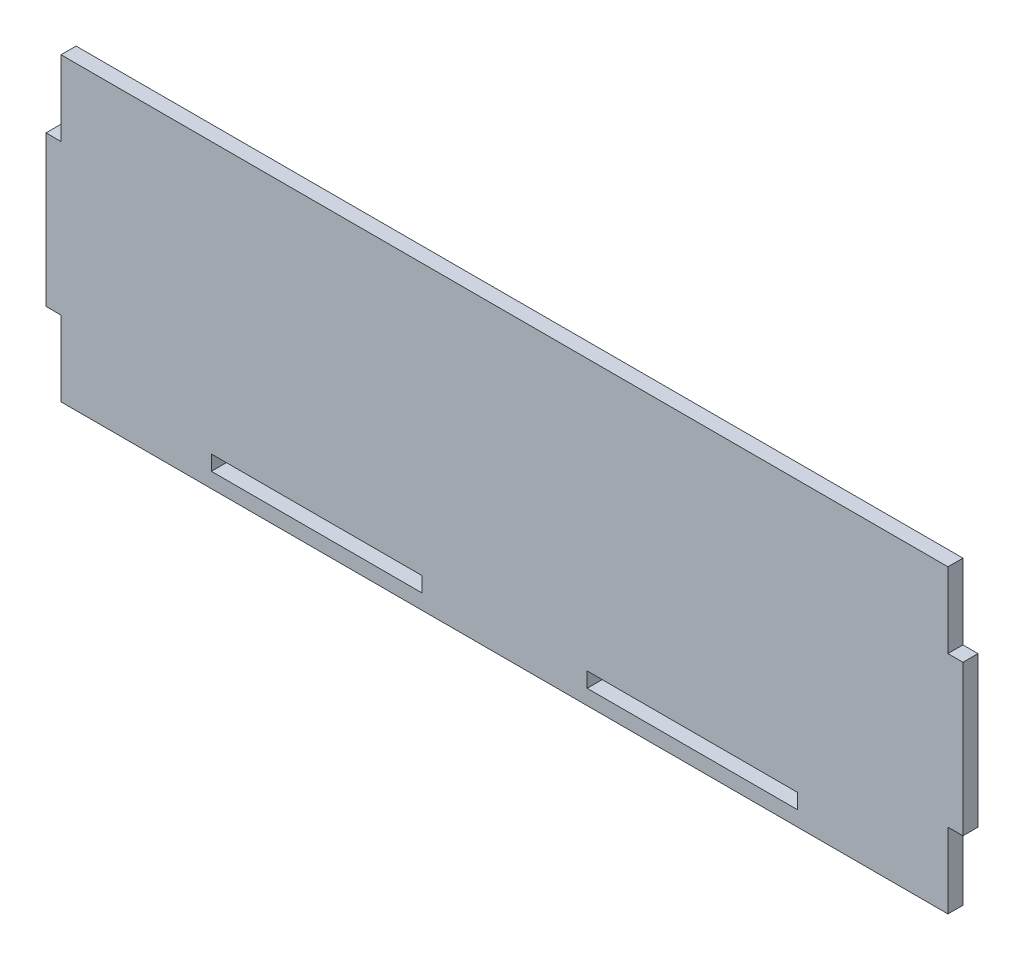
ISO-10303-21;
HEADER;
FILE_DESCRIPTION(('STEP AP214'),'2;1');
FILE_NAME('part.step','',(''),(''),'','','');
FILE_SCHEMA(('AUTOMOTIVE_DESIGN { 1 0 10303 214 1 1 1 1 }'));
ENDSEC;
DATA;
#1=APPLICATION_CONTEXT('core data for automotive mechanical design processes');
#2=APPLICATION_PROTOCOL_DEFINITION('international standard','automotive_design',2000,#1);
#3=PRODUCT_CONTEXT('',#1,'mechanical');
#4=PRODUCT('Part','Part','',(#3));
#5=PRODUCT_RELATED_PRODUCT_CATEGORY('part','',(#4));
#6=PRODUCT_DEFINITION_FORMATION('','',#4);
#7=PRODUCT_DEFINITION_CONTEXT('part definition',#1,'design');
#8=PRODUCT_DEFINITION('design','',#6,#7);
#9=PRODUCT_DEFINITION_SHAPE('','',#8);
#10=(LENGTH_UNIT() NAMED_UNIT(*) SI_UNIT(.MILLI.,.METRE.));
#11=(NAMED_UNIT(*) PLANE_ANGLE_UNIT() SI_UNIT($,.RADIAN.));
#12=(NAMED_UNIT(*) SI_UNIT($,.STERADIAN.) SOLID_ANGLE_UNIT());
#13=UNCERTAINTY_MEASURE_WITH_UNIT(LENGTH_MEASURE(1.E-05),#10,'distance_accuracy_value','');
#14=(GEOMETRIC_REPRESENTATION_CONTEXT(3) GLOBAL_UNCERTAINTY_ASSIGNED_CONTEXT((#13)) GLOBAL_UNIT_ASSIGNED_CONTEXT((#10,
#11,#12)) REPRESENTATION_CONTEXT('',''));
#15=CARTESIAN_POINT('',(0.,0.,0.));
#16=DIRECTION('',(0.,0.,1.));
#17=DIRECTION('',(1.,0.,0.));
#18=AXIS2_PLACEMENT_3D('',#15,#16,#17);
#19=CARTESIAN_POINT('',(-295.,0.,5.));
#20=DIRECTION('',(-1.,0.,0.));
#21=DIRECTION('',(0.,0.,1.));
#22=AXIS2_PLACEMENT_3D('',#19,#20,#21);
#23=PLANE('',#22);
#24=DIRECTION('',(0.,1.,0.));
#25=VECTOR('',#24,1.);
#26=CARTESIAN_POINT('',(-295.,0.,0.));
#27=LINE('',#26,#25);
#28=CARTESIAN_POINT('',(-295.,0.,0.));
#29=VERTEX_POINT('',#28);
#30=CARTESIAN_POINT('',(-295.,25.,0.));
#31=VERTEX_POINT('',#30);
#32=EDGE_CURVE('E209',#29,#31,#27,.T.);
#33=ORIENTED_EDGE('',*,*,#32,.F.);
#34=DIRECTION('',(0.,0.,-1.));
#35=VECTOR('',#34,1.);
#36=CARTESIAN_POINT('',(-295.,0.,5.));
#37=LINE('',#36,#35);
#38=CARTESIAN_POINT('',(-295.,0.,5.));
#39=VERTEX_POINT('',#38);
#40=EDGE_CURVE('E11',#39,#29,#37,.T.);
#41=ORIENTED_EDGE('',*,*,#40,.F.);
#42=DIRECTION('',(0.,1.,0.));
#43=VECTOR('',#42,1.);
#44=CARTESIAN_POINT('',(-295.,0.,5.));
#45=LINE('',#44,#43);
#46=CARTESIAN_POINT('',(-295.,25.,5.));
#47=VERTEX_POINT('',#46);
#48=EDGE_CURVE('E242',#39,#47,#45,.T.);
#49=ORIENTED_EDGE('',*,*,#48,.T.);
#50=DIRECTION('',(0.,0.,-1.));
#51=VECTOR('',#50,1.);
#52=CARTESIAN_POINT('',(-295.,25.,5.));
#53=LINE('',#52,#51);
#54=EDGE_CURVE('E270',#47,#31,#53,.T.);
#55=ORIENTED_EDGE('',*,*,#54,.T.);
#56=EDGE_LOOP('',(#33,#41,#49,#55));
#57=FACE_BOUND('',#56,.T.);
#58=ADVANCED_FACE('F36',(#57),#23,.T.);
#59=CARTESIAN_POINT('',(0.,0.,5.));
#60=DIRECTION('',(0.,-1.,0.));
#61=DIRECTION('',(0.,0.,-1.));
#62=AXIS2_PLACEMENT_3D('',#59,#60,#61);
#63=PLANE('',#62);
#64=DIRECTION('',(-1.,0.,0.));
#65=VECTOR('',#64,1.);
#66=CARTESIAN_POINT('',(0.,0.,0.));
#67=LINE('',#66,#65);
#68=CARTESIAN_POINT('',(0.,0.,0.));
#69=VERTEX_POINT('',#68);
#70=EDGE_CURVE('E273',#69,#29,#67,.T.);
#71=ORIENTED_EDGE('',*,*,#70,.F.);
#72=DIRECTION('',(0.,0.,-1.));
#73=VECTOR('',#72,1.);
#74=CARTESIAN_POINT('',(0.,0.,5.));
#75=LINE('',#74,#73);
#76=CARTESIAN_POINT('',(0.,0.,5.));
#77=VERTEX_POINT('',#76);
#78=EDGE_CURVE('E44',#77,#69,#75,.T.);
#79=ORIENTED_EDGE('',*,*,#78,.F.);
#80=DIRECTION('',(-1.,0.,0.));
#81=VECTOR('',#80,1.);
#82=CARTESIAN_POINT('',(0.,0.,5.));
#83=LINE('',#82,#81);
#84=EDGE_CURVE('E245',#77,#39,#83,.T.);
#85=ORIENTED_EDGE('',*,*,#84,.T.);
#86=ORIENTED_EDGE('',*,*,#40,.T.);
#87=EDGE_LOOP('',(#71,#79,#85,#86));
#88=FACE_BOUND('',#87,.T.);
#89=ADVANCED_FACE('F38',(#88),#63,.T.);
#90=CARTESIAN_POINT('',(0.,0.,5.));
#91=DIRECTION('',(-1.,0.,0.));
#92=DIRECTION('',(0.,0.,1.));
#93=AXIS2_PLACEMENT_3D('',#90,#91,#92);
#94=PLANE('',#93);
#95=DIRECTION('',(0.,1.,0.));
#96=VECTOR('',#95,1.);
#97=CARTESIAN_POINT('',(0.,0.,0.));
#98=LINE('',#97,#96);
#99=CARTESIAN_POINT('',(0.,25.,0.));
#100=VERTEX_POINT('',#99);
#101=EDGE_CURVE('E277',#69,#100,#98,.T.);
#102=ORIENTED_EDGE('',*,*,#101,.T.);
#103=DIRECTION('',(0.,0.,-1.));
#104=VECTOR('',#103,1.);
#105=CARTESIAN_POINT('',(0.,25.,5.));
#106=LINE('',#105,#104);
#107=CARTESIAN_POINT('',(0.,25.,5.));
#108=VERTEX_POINT('',#107);
#109=EDGE_CURVE('E318',#108,#100,#106,.T.);
#110=ORIENTED_EDGE('',*,*,#109,.F.);
#111=DIRECTION('',(0.,1.,0.));
#112=VECTOR('',#111,1.);
#113=CARTESIAN_POINT('',(0.,0.,5.));
#114=LINE('',#113,#112);
#115=EDGE_CURVE('E250',#77,#108,#114,.T.);
#116=ORIENTED_EDGE('',*,*,#115,.F.);
#117=ORIENTED_EDGE('',*,*,#78,.T.);
#118=EDGE_LOOP('',(#102,#110,#116,#117));
#119=FACE_BOUND('',#118,.T.);
#120=ADVANCED_FACE('F323',(#119),#94,.F.);
#121=CARTESIAN_POINT('',(0.,25.,5.));
#122=DIRECTION('',(0.,1.,0.));
#123=DIRECTION('',(-1.,0.,0.));
#124=AXIS2_PLACEMENT_3D('',#121,#122,#123);
#125=PLANE('',#124);
#126=DIRECTION('',(1.,0.,0.));
#127=VECTOR('',#126,1.);
#128=CARTESIAN_POINT('',(0.,25.,0.));
#129=LINE('',#128,#127);
#130=CARTESIAN_POINT('',(5.,25.,0.));
#131=VERTEX_POINT('',#130);
#132=EDGE_CURVE('E279',#100,#131,#129,.T.);
#133=ORIENTED_EDGE('',*,*,#132,.T.);
#134=DIRECTION('',(0.,0.,-1.));
#135=VECTOR('',#134,1.);
#136=CARTESIAN_POINT('',(5.,25.,5.));
#137=LINE('',#136,#135);
#138=CARTESIAN_POINT('',(5.,25.,5.));
#139=VERTEX_POINT('',#138);
#140=EDGE_CURVE('E316',#139,#131,#137,.T.);
#141=ORIENTED_EDGE('',*,*,#140,.F.);
#142=DIRECTION('',(1.,0.,0.));
#143=VECTOR('',#142,1.);
#144=CARTESIAN_POINT('',(0.,25.,5.));
#145=LINE('',#144,#143);
#146=EDGE_CURVE('E252',#108,#139,#145,.T.);
#147=ORIENTED_EDGE('',*,*,#146,.F.);
#148=ORIENTED_EDGE('',*,*,#109,.T.);
#149=EDGE_LOOP('',(#133,#141,#147,#148));
#150=FACE_BOUND('',#149,.T.);
#151=ADVANCED_FACE('F372',(#150),#125,.F.);
#152=CARTESIAN_POINT('',(5.00000000000001,0.,5.));
#153=DIRECTION('',(1.,0.,0.));
#154=DIRECTION('',(0.,1.,0.));
#155=AXIS2_PLACEMENT_3D('',#152,#153,#154);
#156=PLANE('',#155);
#157=DIRECTION('',(0.,-1.,0.));
#158=VECTOR('',#157,1.);
#159=CARTESIAN_POINT('',(5.00000000000001,0.,0.));
#160=LINE('',#159,#158);
#161=CARTESIAN_POINT('',(5.,75.,0.));
#162=VERTEX_POINT('',#161);
#163=EDGE_CURVE('E283',#162,#131,#160,.T.);
#164=ORIENTED_EDGE('',*,*,#163,.F.);
#165=DIRECTION('',(0.,0.,-1.));
#166=VECTOR('',#165,1.);
#167=CARTESIAN_POINT('',(5.,75.,5.));
#168=LINE('',#167,#166);
#169=CARTESIAN_POINT('',(5.,75.,5.));
#170=VERTEX_POINT('',#169);
#171=EDGE_CURVE('E314',#170,#162,#168,.T.);
#172=ORIENTED_EDGE('',*,*,#171,.F.);
#173=DIRECTION('',(0.,-1.,0.));
#174=VECTOR('',#173,1.);
#175=CARTESIAN_POINT('',(5.00000000000001,0.,5.));
#176=LINE('',#175,#174);
#177=EDGE_CURVE('E255',#170,#139,#176,.T.);
#178=ORIENTED_EDGE('',*,*,#177,.T.);
#179=ORIENTED_EDGE('',*,*,#140,.T.);
#180=EDGE_LOOP('',(#164,#172,#178,#179));
#181=FACE_BOUND('',#180,.T.);
#182=ADVANCED_FACE('F368',(#181),#156,.T.);
#183=CARTESIAN_POINT('',(4.16333634234434E-13,75.,5.));
#184=DIRECTION('',(0.,1.,0.));
#185=DIRECTION('',(-1.,0.,0.));
#186=AXIS2_PLACEMENT_3D('',#183,#184,#185);
#187=PLANE('',#186);
#188=DIRECTION('',(1.,0.,0.));
#189=VECTOR('',#188,1.);
#190=CARTESIAN_POINT('',(4.16333634234434E-13,75.,0.));
#191=LINE('',#190,#189);
#192=CARTESIAN_POINT('',(0.,75.,0.));
#193=VERTEX_POINT('',#192);
#194=EDGE_CURVE('E286',#193,#162,#191,.T.);
#195=ORIENTED_EDGE('',*,*,#194,.F.);
#196=DIRECTION('',(0.,0.,-1.));
#197=VECTOR('',#196,1.);
#198=CARTESIAN_POINT('',(0.,75.,5.));
#199=LINE('',#198,#197);
#200=CARTESIAN_POINT('',(0.,75.,5.));
#201=VERTEX_POINT('',#200);
#202=EDGE_CURVE('E312',#201,#193,#199,.T.);
#203=ORIENTED_EDGE('',*,*,#202,.F.);
#204=DIRECTION('',(1.,0.,0.));
#205=VECTOR('',#204,1.);
#206=CARTESIAN_POINT('',(4.16333634234434E-13,75.,5.));
#207=LINE('',#206,#205);
#208=EDGE_CURVE('E258',#201,#170,#207,.T.);
#209=ORIENTED_EDGE('',*,*,#208,.T.);
#210=ORIENTED_EDGE('',*,*,#171,.T.);
#211=EDGE_LOOP('',(#195,#203,#209,#210));
#212=FACE_BOUND('',#211,.T.);
#213=ADVANCED_FACE('F362',(#212),#187,.T.);
#214=CARTESIAN_POINT('',(0.,100.,0.));
#215=VERTEX_POINT('',#214);
#216=EDGE_CURVE('E280',#193,#215,#98,.T.);
#217=ORIENTED_EDGE('',*,*,#216,.T.);
#218=DIRECTION('',(0.,0.,-1.));
#219=VECTOR('',#218,1.);
#220=CARTESIAN_POINT('',(0.,100.,5.));
#221=LINE('',#220,#219);
#222=CARTESIAN_POINT('',(0.,100.,5.));
#223=VERTEX_POINT('',#222);
#224=EDGE_CURVE('E309',#223,#215,#221,.T.);
#225=ORIENTED_EDGE('',*,*,#224,.F.);
#226=EDGE_CURVE('E253',#201,#223,#114,.T.);
#227=ORIENTED_EDGE('',*,*,#226,.F.);
#228=ORIENTED_EDGE('',*,*,#202,.T.);
#229=EDGE_LOOP('',(#217,#225,#227,#228));
#230=FACE_BOUND('',#229,.T.);
#231=ADVANCED_FACE('F391',(#230),#94,.F.);
#232=CARTESIAN_POINT('',(0.,100.,5.));
#233=DIRECTION('',(0.,-1.,0.));
#234=DIRECTION('',(1.,0.,0.));
#235=AXIS2_PLACEMENT_3D('',#232,#233,#234);
#236=PLANE('',#235);
#237=DIRECTION('',(-1.,0.,0.));
#238=VECTOR('',#237,1.);
#239=CARTESIAN_POINT('',(0.,100.,0.));
#240=LINE('',#239,#238);
#241=CARTESIAN_POINT('',(-295.,100.,0.));
#242=VERTEX_POINT('',#241);
#243=EDGE_CURVE('E289',#215,#242,#240,.T.);
#244=ORIENTED_EDGE('',*,*,#243,.T.);
#245=DIRECTION('',(0.,0.,-1.));
#246=VECTOR('',#245,1.);
#247=CARTESIAN_POINT('',(-295.,100.,5.));
#248=LINE('',#247,#246);
#249=CARTESIAN_POINT('',(-295.,100.,5.));
#250=VERTEX_POINT('',#249);
#251=EDGE_CURVE('E307',#250,#242,#248,.T.);
#252=ORIENTED_EDGE('',*,*,#251,.F.);
#253=DIRECTION('',(-1.,0.,0.));
#254=VECTOR('',#253,1.);
#255=CARTESIAN_POINT('',(0.,100.,5.));
#256=LINE('',#255,#254);
#257=EDGE_CURVE('E261',#223,#250,#256,.T.);
#258=ORIENTED_EDGE('',*,*,#257,.F.);
#259=ORIENTED_EDGE('',*,*,#224,.T.);
#260=EDGE_LOOP('',(#244,#252,#258,#259));
#261=FACE_BOUND('',#260,.T.);
#262=ADVANCED_FACE('F356',(#261),#236,.F.);
#263=CARTESIAN_POINT('',(-295.,75.,0.));
#264=VERTEX_POINT('',#263);
#265=EDGE_CURVE('E274',#264,#242,#27,.T.);
#266=ORIENTED_EDGE('',*,*,#265,.F.);
#267=DIRECTION('',(0.,0.,-1.));
#268=VECTOR('',#267,1.);
#269=CARTESIAN_POINT('',(-295.,75.,5.));
#270=LINE('',#269,#268);
#271=CARTESIAN_POINT('',(-295.,75.,5.));
#272=VERTEX_POINT('',#271);
#273=EDGE_CURVE('E305',#272,#264,#270,.T.);
#274=ORIENTED_EDGE('',*,*,#273,.F.);
#275=EDGE_CURVE('E247',#272,#250,#45,.T.);
#276=ORIENTED_EDGE('',*,*,#275,.T.);
#277=ORIENTED_EDGE('',*,*,#251,.T.);
#278=EDGE_LOOP('',(#266,#274,#276,#277));
#279=FACE_BOUND('',#278,.T.);
#280=ADVANCED_FACE('F349',(#279),#23,.T.);
#281=CARTESIAN_POINT('',(-4.16333634234442E-13,75.0000000000016,5.));
#282=DIRECTION('',(0.,-1.,0.));
#283=DIRECTION('',(1.,0.,0.));
#284=AXIS2_PLACEMENT_3D('',#281,#282,#283);
#285=PLANE('',#284);
#286=DIRECTION('',(-1.,0.,0.));
#287=VECTOR('',#286,1.);
#288=CARTESIAN_POINT('',(-4.16333634234442E-13,75.0000000000016,0.));
#289=LINE('',#288,#287);
#290=CARTESIAN_POINT('',(-300.,75.,0.));
#291=VERTEX_POINT('',#290);
#292=EDGE_CURVE('E292',#264,#291,#289,.T.);
#293=ORIENTED_EDGE('',*,*,#292,.T.);
#294=DIRECTION('',(0.,0.,-1.));
#295=VECTOR('',#294,1.);
#296=CARTESIAN_POINT('',(-300.,75.,5.));
#297=LINE('',#296,#295);
#298=CARTESIAN_POINT('',(-300.,75.,5.));
#299=VERTEX_POINT('',#298);
#300=EDGE_CURVE('E302',#299,#291,#297,.T.);
#301=ORIENTED_EDGE('',*,*,#300,.F.);
#302=DIRECTION('',(-1.,0.,0.));
#303=VECTOR('',#302,1.);
#304=CARTESIAN_POINT('',(-4.16333634234442E-13,75.0000000000016,5.));
#305=LINE('',#304,#303);
#306=EDGE_CURVE('E263',#272,#299,#305,.T.);
#307=ORIENTED_EDGE('',*,*,#306,.F.);
#308=ORIENTED_EDGE('',*,*,#273,.T.);
#309=EDGE_LOOP('',(#293,#301,#307,#308));
#310=FACE_BOUND('',#309,.T.);
#311=ADVANCED_FACE('F375',(#310),#285,.F.);
#312=CARTESIAN_POINT('',(-300.,0.,5.));
#313=DIRECTION('',(1.,0.,0.));
#314=DIRECTION('',(0.,0.,-1.));
#315=AXIS2_PLACEMENT_3D('',#312,#313,#314);
#316=PLANE('',#315);
#317=DIRECTION('',(0.,-1.,0.));
#318=VECTOR('',#317,1.);
#319=CARTESIAN_POINT('',(-300.,0.,0.));
#320=LINE('',#319,#318);
#321=CARTESIAN_POINT('',(-300.,25.,0.));
#322=VERTEX_POINT('',#321);
#323=EDGE_CURVE('E294',#291,#322,#320,.T.);
#324=ORIENTED_EDGE('',*,*,#323,.T.);
#325=DIRECTION('',(0.,0.,-1.));
#326=VECTOR('',#325,1.);
#327=CARTESIAN_POINT('',(-300.,25.,5.));
#328=LINE('',#327,#326);
#329=CARTESIAN_POINT('',(-300.,25.,5.));
#330=VERTEX_POINT('',#329);
#331=EDGE_CURVE('E300',#330,#322,#328,.T.);
#332=ORIENTED_EDGE('',*,*,#331,.F.);
#333=DIRECTION('',(0.,-1.,0.));
#334=VECTOR('',#333,1.);
#335=CARTESIAN_POINT('',(-300.,0.,5.));
#336=LINE('',#335,#334);
#337=EDGE_CURVE('E265',#299,#330,#336,.T.);
#338=ORIENTED_EDGE('',*,*,#337,.F.);
#339=ORIENTED_EDGE('',*,*,#300,.T.);
#340=EDGE_LOOP('',(#324,#332,#338,#339));
#341=FACE_BOUND('',#340,.T.);
#342=ADVANCED_FACE('F341',(#341),#316,.F.);
#343=CARTESIAN_POINT('',(0.,24.9999999999996,5.));
#344=DIRECTION('',(0.,-1.,0.));
#345=DIRECTION('',(1.,0.,0.));
#346=AXIS2_PLACEMENT_3D('',#343,#344,#345);
#347=PLANE('',#346);
#348=DIRECTION('',(-1.,0.,0.));
#349=VECTOR('',#348,1.);
#350=CARTESIAN_POINT('',(0.,24.9999999999996,0.));
#351=LINE('',#350,#349);
#352=EDGE_CURVE('E246',#31,#322,#351,.T.);
#353=ORIENTED_EDGE('',*,*,#352,.F.);
#354=ORIENTED_EDGE('',*,*,#54,.F.);
#355=DIRECTION('',(-1.,0.,0.));
#356=VECTOR('',#355,1.);
#357=CARTESIAN_POINT('',(0.,24.9999999999996,5.));
#358=LINE('',#357,#356);
#359=EDGE_CURVE('E267',#47,#330,#358,.T.);
#360=ORIENTED_EDGE('',*,*,#359,.T.);
#361=ORIENTED_EDGE('',*,*,#331,.T.);
#362=EDGE_LOOP('',(#353,#354,#360,#361));
#363=FACE_BOUND('',#362,.T.);
#364=ADVANCED_FACE('F336',(#363),#347,.T.);
#365=CARTESIAN_POINT('',(0.,0.,5.));
#366=DIRECTION('',(0.,0.,1.));
#367=DIRECTION('',(1.,0.,0.));
#368=AXIS2_PLACEMENT_3D('',#365,#366,#367);
#369=PLANE('',#368);
#370=DIRECTION('',(0.,-1.,0.));
#371=VECTOR('',#370,1.);
#372=CARTESIAN_POINT('',(-245.,10.,5.));
#373=LINE('',#372,#371);
#374=CARTESIAN_POINT('',(-245.,10.,5.));
#375=VERTEX_POINT('',#374);
#376=CARTESIAN_POINT('',(-245.,5.,5.));
#377=VERTEX_POINT('',#376);
#378=EDGE_CURVE('E51',#375,#377,#373,.T.);
#379=ORIENTED_EDGE('',*,*,#378,.F.);
#380=DIRECTION('',(-1.,0.,0.));
#381=VECTOR('',#380,1.);
#382=CARTESIAN_POINT('',(-245.,10.,5.));
#383=LINE('',#382,#381);
#384=CARTESIAN_POINT('',(-175.,10.,5.));
#385=VERTEX_POINT('',#384);
#386=EDGE_CURVE('E193',#385,#375,#383,.T.);
#387=ORIENTED_EDGE('',*,*,#386,.F.);
#388=DIRECTION('',(0.,1.,0.));
#389=VECTOR('',#388,1.);
#390=CARTESIAN_POINT('',(-175.,10.,5.));
#391=LINE('',#390,#389);
#392=CARTESIAN_POINT('',(-175.,5.,5.));
#393=VERTEX_POINT('',#392);
#394=EDGE_CURVE('E196',#393,#385,#391,.T.);
#395=ORIENTED_EDGE('',*,*,#394,.F.);
#396=DIRECTION('',(1.,0.,0.));
#397=VECTOR('',#396,1.);
#398=CARTESIAN_POINT('',(-245.,5.,5.));
#399=LINE('',#398,#397);
#400=EDGE_CURVE('E202',#377,#393,#399,.T.);
#401=ORIENTED_EDGE('',*,*,#400,.F.);
#402=EDGE_LOOP('',(#379,#387,#395,#401));
#403=FACE_BOUND('',#402,.T.);
#404=DIRECTION('',(-1.,0.,0.));
#405=VECTOR('',#404,1.);
#406=CARTESIAN_POINT('',(-50.,10.,5.));
#407=LINE('',#406,#405);
#408=CARTESIAN_POINT('',(-50.,10.,5.));
#409=VERTEX_POINT('',#408);
#410=CARTESIAN_POINT('',(-120.,10.,5.));
#411=VERTEX_POINT('',#410);
#412=EDGE_CURVE('E59',#409,#411,#407,.T.);
#413=ORIENTED_EDGE('',*,*,#412,.F.);
#414=DIRECTION('',(0.,1.,0.));
#415=VECTOR('',#414,1.);
#416=CARTESIAN_POINT('',(-50.,10.,5.));
#417=LINE('',#416,#415);
#418=CARTESIAN_POINT('',(-50.,5.,5.));
#419=VERTEX_POINT('',#418);
#420=EDGE_CURVE('E217',#419,#409,#417,.T.);
#421=ORIENTED_EDGE('',*,*,#420,.F.);
#422=DIRECTION('',(1.,0.,0.));
#423=VECTOR('',#422,1.);
#424=CARTESIAN_POINT('',(-50.,5.,5.));
#425=LINE('',#424,#423);
#426=CARTESIAN_POINT('',(-120.,5.,5.));
#427=VERTEX_POINT('',#426);
#428=EDGE_CURVE('E231',#427,#419,#425,.T.);
#429=ORIENTED_EDGE('',*,*,#428,.F.);
#430=DIRECTION('',(0.,-1.,0.));
#431=VECTOR('',#430,1.);
#432=CARTESIAN_POINT('',(-120.,10.,5.));
#433=LINE('',#432,#431);
#434=EDGE_CURVE('E228',#411,#427,#433,.T.);
#435=ORIENTED_EDGE('',*,*,#434,.F.);
#436=EDGE_LOOP('',(#413,#421,#429,#435));
#437=FACE_BOUND('',#436,.T.);
#438=ORIENTED_EDGE('',*,*,#48,.F.);
#439=ORIENTED_EDGE('',*,*,#84,.F.);
#440=ORIENTED_EDGE('',*,*,#115,.T.);
#441=ORIENTED_EDGE('',*,*,#146,.T.);
#442=ORIENTED_EDGE('',*,*,#177,.F.);
#443=ORIENTED_EDGE('',*,*,#208,.F.);
#444=ORIENTED_EDGE('',*,*,#226,.T.);
#445=ORIENTED_EDGE('',*,*,#257,.T.);
#446=ORIENTED_EDGE('',*,*,#275,.F.);
#447=ORIENTED_EDGE('',*,*,#306,.T.);
#448=ORIENTED_EDGE('',*,*,#337,.T.);
#449=ORIENTED_EDGE('',*,*,#359,.F.);
#450=EDGE_LOOP('',(#438,#439,#440,#441,#442,#443,#444,#445,#446,#447,#448,#449));
#451=FACE_BOUND('',#450,.T.);
#452=ADVANCED_FACE('F374',(#403,#437,#451),#369,.T.);
#453=CARTESIAN_POINT('',(0.,0.,0.));
#454=DIRECTION('',(0.,0.,1.));
#455=DIRECTION('',(1.,0.,0.));
#456=AXIS2_PLACEMENT_3D('',#453,#454,#455);
#457=PLANE('',#456);
#458=DIRECTION('',(-1.,0.,0.));
#459=VECTOR('',#458,1.);
#460=CARTESIAN_POINT('',(-245.,10.,0.));
#461=LINE('',#460,#459);
#462=CARTESIAN_POINT('',(-175.,10.,0.));
#463=VERTEX_POINT('',#462);
#464=CARTESIAN_POINT('',(-245.,10.,0.));
#465=VERTEX_POINT('',#464);
#466=EDGE_CURVE('E180',#463,#465,#461,.T.);
#467=ORIENTED_EDGE('',*,*,#466,.T.);
#468=DIRECTION('',(0.,-1.,0.));
#469=VECTOR('',#468,1.);
#470=CARTESIAN_POINT('',(-245.,10.,0.));
#471=LINE('',#470,#469);
#472=CARTESIAN_POINT('',(-245.,5.,0.));
#473=VERTEX_POINT('',#472);
#474=EDGE_CURVE('E174',#465,#473,#471,.T.);
#475=ORIENTED_EDGE('',*,*,#474,.T.);
#476=DIRECTION('',(1.,0.,0.));
#477=VECTOR('',#476,1.);
#478=CARTESIAN_POINT('',(-245.,5.,0.));
#479=LINE('',#478,#477);
#480=CARTESIAN_POINT('',(-175.,5.,0.));
#481=VERTEX_POINT('',#480);
#482=EDGE_CURVE('E184',#473,#481,#479,.T.);
#483=ORIENTED_EDGE('',*,*,#482,.T.);
#484=DIRECTION('',(0.,1.,0.));
#485=VECTOR('',#484,1.);
#486=CARTESIAN_POINT('',(-175.,10.,0.));
#487=LINE('',#486,#485);
#488=EDGE_CURVE('E188',#481,#463,#487,.T.);
#489=ORIENTED_EDGE('',*,*,#488,.T.);
#490=EDGE_LOOP('',(#467,#475,#483,#489));
#491=FACE_BOUND('',#490,.T.);
#492=DIRECTION('',(0.,1.,0.));
#493=VECTOR('',#492,1.);
#494=CARTESIAN_POINT('',(-50.,10.,0.));
#495=LINE('',#494,#493);
#496=CARTESIAN_POINT('',(-50.,5.,0.));
#497=VERTEX_POINT('',#496);
#498=CARTESIAN_POINT('',(-50.,10.,0.));
#499=VERTEX_POINT('',#498);
#500=EDGE_CURVE('E223',#497,#499,#495,.T.);
#501=ORIENTED_EDGE('',*,*,#500,.T.);
#502=DIRECTION('',(-1.,0.,0.));
#503=VECTOR('',#502,1.);
#504=CARTESIAN_POINT('',(-50.,10.,0.));
#505=LINE('',#504,#503);
#506=CARTESIAN_POINT('',(-120.,10.,0.));
#507=VERTEX_POINT('',#506);
#508=EDGE_CURVE('E213',#499,#507,#505,.T.);
#509=ORIENTED_EDGE('',*,*,#508,.T.);
#510=DIRECTION('',(0.,-1.,0.));
#511=VECTOR('',#510,1.);
#512=CARTESIAN_POINT('',(-120.,10.,0.));
#513=LINE('',#512,#511);
#514=CARTESIAN_POINT('',(-120.,5.,0.));
#515=VERTEX_POINT('',#514);
#516=EDGE_CURVE('E216',#507,#515,#513,.T.);
#517=ORIENTED_EDGE('',*,*,#516,.T.);
#518=DIRECTION('',(1.,0.,0.));
#519=VECTOR('',#518,1.);
#520=CARTESIAN_POINT('',(-50.,5.,0.));
#521=LINE('',#520,#519);
#522=EDGE_CURVE('E220',#515,#497,#521,.T.);
#523=ORIENTED_EDGE('',*,*,#522,.T.);
#524=EDGE_LOOP('',(#501,#509,#517,#523));
#525=FACE_BOUND('',#524,.T.);
#526=ORIENTED_EDGE('',*,*,#32,.T.);
#527=ORIENTED_EDGE('',*,*,#352,.T.);
#528=ORIENTED_EDGE('',*,*,#323,.F.);
#529=ORIENTED_EDGE('',*,*,#292,.F.);
#530=ORIENTED_EDGE('',*,*,#265,.T.);
#531=ORIENTED_EDGE('',*,*,#243,.F.);
#532=ORIENTED_EDGE('',*,*,#216,.F.);
#533=ORIENTED_EDGE('',*,*,#194,.T.);
#534=ORIENTED_EDGE('',*,*,#163,.T.);
#535=ORIENTED_EDGE('',*,*,#132,.F.);
#536=ORIENTED_EDGE('',*,*,#101,.F.);
#537=ORIENTED_EDGE('',*,*,#70,.T.);
#538=EDGE_LOOP('',(#526,#527,#528,#529,#530,#531,#532,#533,#534,#535,#536,#537));
#539=FACE_BOUND('',#538,.T.);
#540=ADVANCED_FACE('F190',(#491,#525,#539),#457,.F.);
#541=CARTESIAN_POINT('',(-50.,10.,0.));
#542=DIRECTION('',(0.,1.,0.));
#543=DIRECTION('',(-1.,0.,0.));
#544=AXIS2_PLACEMENT_3D('',#541,#542,#543);
#545=PLANE('',#544);
#546=ORIENTED_EDGE('',*,*,#412,.T.);
#547=DIRECTION('',(0.,0.,1.));
#548=VECTOR('',#547,1.);
#549=CARTESIAN_POINT('',(-120.,10.,0.));
#550=LINE('',#549,#548);
#551=EDGE_CURVE('E226',#507,#411,#550,.T.);
#552=ORIENTED_EDGE('',*,*,#551,.F.);
#553=ORIENTED_EDGE('',*,*,#508,.F.);
#554=DIRECTION('',(0.,0.,1.));
#555=VECTOR('',#554,1.);
#556=CARTESIAN_POINT('',(-50.,10.,0.));
#557=LINE('',#556,#555);
#558=EDGE_CURVE('E203',#499,#409,#557,.T.);
#559=ORIENTED_EDGE('',*,*,#558,.T.);
#560=EDGE_LOOP('',(#546,#552,#553,#559));
#561=FACE_BOUND('',#560,.T.);
#562=ADVANCED_FACE('F494',(#561),#545,.F.);
#563=CARTESIAN_POINT('',(-50.,10.,0.));
#564=DIRECTION('',(1.,0.,0.));
#565=DIRECTION('',(0.,0.,-1.));
#566=AXIS2_PLACEMENT_3D('',#563,#564,#565);
#567=PLANE('',#566);
#568=ORIENTED_EDGE('',*,*,#420,.T.);
#569=ORIENTED_EDGE('',*,*,#558,.F.);
#570=ORIENTED_EDGE('',*,*,#500,.F.);
#571=DIRECTION('',(0.,0.,1.));
#572=VECTOR('',#571,1.);
#573=CARTESIAN_POINT('',(-50.,5.,0.));
#574=LINE('',#573,#572);
#575=EDGE_CURVE('E237',#497,#419,#574,.T.);
#576=ORIENTED_EDGE('',*,*,#575,.T.);
#577=EDGE_LOOP('',(#568,#569,#570,#576));
#578=FACE_BOUND('',#577,.T.);
#579=ADVANCED_FACE('F508',(#578),#567,.F.);
#580=CARTESIAN_POINT('',(-50.,5.,0.));
#581=DIRECTION('',(0.,-1.,0.));
#582=DIRECTION('',(0.,0.,-1.));
#583=AXIS2_PLACEMENT_3D('',#580,#581,#582);
#584=PLANE('',#583);
#585=ORIENTED_EDGE('',*,*,#428,.T.);
#586=ORIENTED_EDGE('',*,*,#575,.F.);
#587=ORIENTED_EDGE('',*,*,#522,.F.);
#588=DIRECTION('',(0.,0.,1.));
#589=VECTOR('',#588,1.);
#590=CARTESIAN_POINT('',(-120.,5.,0.));
#591=LINE('',#590,#589);
#592=EDGE_CURVE('E239',#515,#427,#591,.T.);
#593=ORIENTED_EDGE('',*,*,#592,.T.);
#594=EDGE_LOOP('',(#585,#586,#587,#593));
#595=FACE_BOUND('',#594,.T.);
#596=ADVANCED_FACE('F516',(#595),#584,.F.);
#597=CARTESIAN_POINT('',(-120.,10.,0.));
#598=DIRECTION('',(-1.,0.,0.));
#599=DIRECTION('',(0.,0.,1.));
#600=AXIS2_PLACEMENT_3D('',#597,#598,#599);
#601=PLANE('',#600);
#602=ORIENTED_EDGE('',*,*,#434,.T.);
#603=ORIENTED_EDGE('',*,*,#592,.F.);
#604=ORIENTED_EDGE('',*,*,#516,.F.);
#605=ORIENTED_EDGE('',*,*,#551,.T.);
#606=EDGE_LOOP('',(#602,#603,#604,#605));
#607=FACE_BOUND('',#606,.T.);
#608=ADVANCED_FACE('F525',(#607),#601,.F.);
#609=CARTESIAN_POINT('',(-245.,10.,0.));
#610=DIRECTION('',(-1.,0.,0.));
#611=DIRECTION('',(0.,0.,1.));
#612=AXIS2_PLACEMENT_3D('',#609,#610,#611);
#613=PLANE('',#612);
#614=ORIENTED_EDGE('',*,*,#378,.T.);
#615=DIRECTION('',(0.,0.,1.));
#616=VECTOR('',#615,1.);
#617=CARTESIAN_POINT('',(-245.,5.,0.));
#618=LINE('',#617,#616);
#619=EDGE_CURVE('E170',#473,#377,#618,.T.);
#620=ORIENTED_EDGE('',*,*,#619,.F.);
#621=ORIENTED_EDGE('',*,*,#474,.F.);
#622=DIRECTION('',(0.,0.,1.));
#623=VECTOR('',#622,1.);
#624=CARTESIAN_POINT('',(-245.,10.,0.));
#625=LINE('',#624,#623);
#626=EDGE_CURVE('E207',#465,#375,#625,.T.);
#627=ORIENTED_EDGE('',*,*,#626,.T.);
#628=EDGE_LOOP('',(#614,#620,#621,#627));
#629=FACE_BOUND('',#628,.T.);
#630=ADVANCED_FACE('F172',(#629),#613,.F.);
#631=CARTESIAN_POINT('',(-245.,10.,0.));
#632=DIRECTION('',(0.,1.,0.));
#633=DIRECTION('',(-1.,0.,0.));
#634=AXIS2_PLACEMENT_3D('',#631,#632,#633);
#635=PLANE('',#634);
#636=ORIENTED_EDGE('',*,*,#386,.T.);
#637=ORIENTED_EDGE('',*,*,#626,.F.);
#638=ORIENTED_EDGE('',*,*,#466,.F.);
#639=DIRECTION('',(0.,0.,1.));
#640=VECTOR('',#639,1.);
#641=CARTESIAN_POINT('',(-175.,10.,0.));
#642=LINE('',#641,#640);
#643=EDGE_CURVE('E210',#463,#385,#642,.T.);
#644=ORIENTED_EDGE('',*,*,#643,.T.);
#645=EDGE_LOOP('',(#636,#637,#638,#644));
#646=FACE_BOUND('',#645,.T.);
#647=ADVANCED_FACE('F542',(#646),#635,.F.);
#648=CARTESIAN_POINT('',(-175.,10.,0.));
#649=DIRECTION('',(1.,0.,0.));
#650=DIRECTION('',(0.,0.,-1.));
#651=AXIS2_PLACEMENT_3D('',#648,#649,#650);
#652=PLANE('',#651);
#653=ORIENTED_EDGE('',*,*,#394,.T.);
#654=ORIENTED_EDGE('',*,*,#643,.F.);
#655=ORIENTED_EDGE('',*,*,#488,.F.);
#656=DIRECTION('',(0.,0.,1.));
#657=VECTOR('',#656,1.);
#658=CARTESIAN_POINT('',(-175.,5.,0.));
#659=LINE('',#658,#657);
#660=EDGE_CURVE('E179',#481,#393,#659,.T.);
#661=ORIENTED_EDGE('',*,*,#660,.T.);
#662=EDGE_LOOP('',(#653,#654,#655,#661));
#663=FACE_BOUND('',#662,.T.);
#664=ADVANCED_FACE('F550',(#663),#652,.F.);
#665=CARTESIAN_POINT('',(-245.,5.,0.));
#666=DIRECTION('',(0.,-1.,0.));
#667=DIRECTION('',(0.,0.,-1.));
#668=AXIS2_PLACEMENT_3D('',#665,#666,#667);
#669=PLANE('',#668);
#670=ORIENTED_EDGE('',*,*,#400,.T.);
#671=ORIENTED_EDGE('',*,*,#660,.F.);
#672=ORIENTED_EDGE('',*,*,#482,.F.);
#673=ORIENTED_EDGE('',*,*,#619,.T.);
#674=EDGE_LOOP('',(#670,#671,#672,#673));
#675=FACE_BOUND('',#674,.T.);
#676=ADVANCED_FACE('F185',(#675),#669,.F.);
#677=CLOSED_SHELL('',(#58,#89,#120,#151,#182,#213,#231,#262,#280,#311,#342,#364,#452,#540,#562,
#579,#596,#608,#630,#647,#664,#676));
#678=MANIFOLD_SOLID_BREP('B2',#677);
#679=ADVANCED_BREP_SHAPE_REPRESENTATION('',(#18,#678),#14);
#680=SHAPE_DEFINITION_REPRESENTATION(#9,#679);
ENDSEC;
END-ISO-10303-21;
